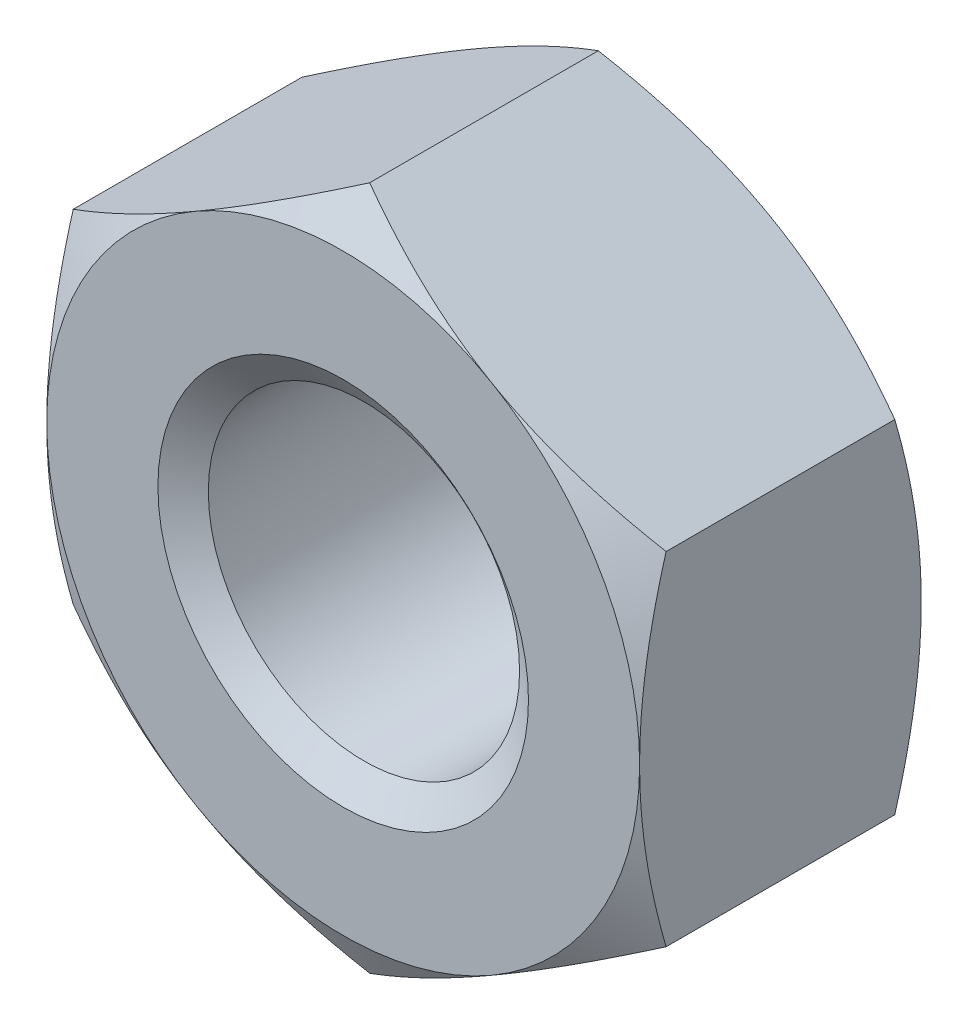
ISO-10303-21;
HEADER;
FILE_DESCRIPTION(('STEP AP214'),'2;1');
FILE_NAME('part.step','',(''),(''),'','','');
FILE_SCHEMA(('AUTOMOTIVE_DESIGN { 1 0 10303 214 1 1 1 1 }'));
ENDSEC;
DATA;
#1=APPLICATION_CONTEXT('core data for automotive mechanical design processes');
#2=APPLICATION_PROTOCOL_DEFINITION('international standard','automotive_design',2000,#1);
#3=PRODUCT_CONTEXT('',#1,'mechanical');
#4=PRODUCT('Part','Part','',(#3));
#5=PRODUCT_RELATED_PRODUCT_CATEGORY('part','',(#4));
#6=PRODUCT_DEFINITION_FORMATION('','',#4);
#7=PRODUCT_DEFINITION_CONTEXT('part definition',#1,'design');
#8=PRODUCT_DEFINITION('design','',#6,#7);
#9=PRODUCT_DEFINITION_SHAPE('','',#8);
#10=(LENGTH_UNIT() NAMED_UNIT(*) SI_UNIT(.MILLI.,.METRE.));
#11=(NAMED_UNIT(*) PLANE_ANGLE_UNIT() SI_UNIT($,.RADIAN.));
#12=(NAMED_UNIT(*) SI_UNIT($,.STERADIAN.) SOLID_ANGLE_UNIT());
#13=UNCERTAINTY_MEASURE_WITH_UNIT(LENGTH_MEASURE(1.E-05),#10,'distance_accuracy_value','');
#14=(GEOMETRIC_REPRESENTATION_CONTEXT(3) GLOBAL_UNCERTAINTY_ASSIGNED_CONTEXT((#13)) GLOBAL_UNIT_ASSIGNED_CONTEXT((#10,
#11,#12)) REPRESENTATION_CONTEXT('',''));
#15=CARTESIAN_POINT('',(0.,0.,0.));
#16=DIRECTION('',(0.,0.,1.));
#17=DIRECTION('',(1.,0.,0.));
#18=AXIS2_PLACEMENT_3D('',#15,#16,#17);
#19=CARTESIAN_POINT('',(0.,0.,-3.8));
#20=DIRECTION('',(0.,0.,1.));
#21=DIRECTION('',(1.,0.,0.));
#22=AXIS2_PLACEMENT_3D('',#19,#20,#21);
#23=CYLINDRICAL_SURFACE('',#22,2.1);
#24=CARTESIAN_POINT('',(0.,0.,-0.280083015283883));
#25=DIRECTION('',(0.,0.,1.));
#26=DIRECTION('',(1.,0.,0.));
#27=AXIS2_PLACEMENT_3D('',#24,#25,#26);
#28=CIRCLE('',#27,2.1);
#29=CARTESIAN_POINT('',(2.1,0.,-0.280083015283883));
#30=VERTEX_POINT('',#29);
#31=EDGE_CURVE('E177',#30,#30,#28,.F.);
#32=CARTESIAN_POINT('',(0.,0.,-3.49451698471611));
#33=DIRECTION('',(0.,0.,-1.));
#34=DIRECTION('',(-1.,0.,0.));
#35=AXIS2_PLACEMENT_3D('',#32,#33,#34);
#36=CIRCLE('',#35,2.1);
#37=CARTESIAN_POINT('',(2.1,0.,-3.49451698471611));
#38=VERTEX_POINT('',#37);
#39=EDGE_CURVE('E42',#38,#38,#36,.F.);
#40=CARTESIAN_POINT('',(2.1,0.,-0.280083015283883));
#41=CARTESIAN_POINT('',(2.1,0.,-0.313566702465469));
#42=CARTESIAN_POINT('',(2.1,0.,-0.347050389647055));
#43=CARTESIAN_POINT('',(2.1,0.,-0.414017764010226));
#44=CARTESIAN_POINT('',(2.1,0.,-0.447501451191812));
#45=CARTESIAN_POINT('',(2.1,0.,-0.514468825554983));
#46=CARTESIAN_POINT('',(2.1,0.,-0.547952512736569));
#47=CARTESIAN_POINT('',(2.1,0.,-0.614919887099741));
#48=CARTESIAN_POINT('',(2.1,0.,-0.648403574281326));
#49=CARTESIAN_POINT('',(2.1,0.,-0.715370948644498));
#50=CARTESIAN_POINT('',(2.1,0.,-0.748854635826083));
#51=CARTESIAN_POINT('',(2.1,0.,-0.815822010189255));
#52=CARTESIAN_POINT('',(2.1,0.,-0.84930569737084));
#53=CARTESIAN_POINT('',(2.1,0.,-0.916273071734012));
#54=CARTESIAN_POINT('',(2.1,0.,-0.949756758915598));
#55=CARTESIAN_POINT('',(2.1,0.,-1.01672413327877));
#56=CARTESIAN_POINT('',(2.1,0.,-1.05020782046035));
#57=CARTESIAN_POINT('',(2.1,0.,-1.11717519482353));
#58=CARTESIAN_POINT('',(2.1,0.,-1.15065888200511));
#59=CARTESIAN_POINT('',(2.1,0.,-1.21762625636828));
#60=CARTESIAN_POINT('',(2.1,0.,-1.25110994354987));
#61=CARTESIAN_POINT('',(2.1,0.,-1.31807731791304));
#62=CARTESIAN_POINT('',(2.1,0.,-1.35156100509463));
#63=CARTESIAN_POINT('',(2.1,0.,-1.4185283794578));
#64=CARTESIAN_POINT('',(2.1,0.,-1.45201206663938));
#65=CARTESIAN_POINT('',(2.1,0.,-1.51897944100255));
#66=CARTESIAN_POINT('',(2.1,0.,-1.55246312818414));
#67=CARTESIAN_POINT('',(2.1,0.,-1.61943050254731));
#68=CARTESIAN_POINT('',(2.1,0.,-1.6529141897289));
#69=CARTESIAN_POINT('',(2.1,0.,-1.71988156409207));
#70=CARTESIAN_POINT('',(2.1,0.,-1.75336525127366));
#71=CARTESIAN_POINT('',(2.1,0.,-1.82033262563683));
#72=CARTESIAN_POINT('',(2.1,0.,-1.85381631281841));
#73=CARTESIAN_POINT('',(2.1,0.,-1.92078368718158));
#74=CARTESIAN_POINT('',(2.1,0.,-1.95426737436317));
#75=CARTESIAN_POINT('',(2.1,0.,-2.02123474872634));
#76=CARTESIAN_POINT('',(2.1,0.,-2.05471843590793));
#77=CARTESIAN_POINT('',(2.1,0.,-2.1216858102711));
#78=CARTESIAN_POINT('',(2.1,0.,-2.15516949745268));
#79=CARTESIAN_POINT('',(2.1,0.,-2.22213687181585));
#80=CARTESIAN_POINT('',(2.1,0.,-2.25562055899744));
#81=CARTESIAN_POINT('',(2.1,0.,-2.32258793336061));
#82=CARTESIAN_POINT('',(2.1,0.,-2.3560716205422));
#83=CARTESIAN_POINT('',(2.1,0.,-2.42303899490537));
#84=CARTESIAN_POINT('',(2.1,0.,-2.45652268208696));
#85=CARTESIAN_POINT('',(2.1,0.,-2.52349005645013));
#86=CARTESIAN_POINT('',(2.1,0.,-2.55697374363171));
#87=CARTESIAN_POINT('',(2.1,0.,-2.62394111799488));
#88=CARTESIAN_POINT('',(2.1,0.,-2.65742480517647));
#89=CARTESIAN_POINT('',(2.1,0.,-2.72439217953964));
#90=CARTESIAN_POINT('',(2.1,0.,-2.75787586672123));
#91=CARTESIAN_POINT('',(2.1,0.,-2.8248432410844));
#92=CARTESIAN_POINT('',(2.1,0.,-2.85832692826598));
#93=CARTESIAN_POINT('',(2.1,0.,-2.92529430262916));
#94=CARTESIAN_POINT('',(2.1,0.,-2.95877798981074));
#95=CARTESIAN_POINT('',(2.1,0.,-3.02574536417391));
#96=CARTESIAN_POINT('',(2.1,0.,-3.0592290513555));
#97=CARTESIAN_POINT('',(2.1,0.,-3.12619642571867));
#98=CARTESIAN_POINT('',(2.1,0.,-3.15968011290025));
#99=CARTESIAN_POINT('',(2.1,0.,-3.22664748726343));
#100=CARTESIAN_POINT('',(2.1,0.,-3.26013117444501));
#101=CARTESIAN_POINT('',(2.1,0.,-3.32709854880818));
#102=CARTESIAN_POINT('',(2.1,0.,-3.36058223598977));
#103=CARTESIAN_POINT('',(2.1,0.,-3.42754961035294));
#104=CARTESIAN_POINT('',(2.1,0.,-3.46103329753453));
#105=CARTESIAN_POINT('',(2.1,0.,-3.49451698471611));
#106=B_SPLINE_CURVE_WITH_KNOTS('',3,(#40,#41,#42,#43,#44,#45,#46,#47,#48,#49,#50,#51,#52,#53,
#54,#55,#56,#57,#58,#59,#60,#61,#62,#63,#64,#65,#66,#67,#68,#69,#70,#71,#72,#73,#74,#75,#76,#77,
#78,#79,#80,#81,#82,#83,#84,#85,#86,#87,#88,#89,#90,#91,#92,#93,#94,#95,#96,#97,#98,#99,#100,
#101,#102,#103,#104,#105),.UNSPECIFIED.,.F.,.F.,(4,2,2,2,2,2,2,2,2,2,2,2,2,2,2,2,2,2,2,2,2,2,2,
2,2,2,2,2,2,2,2,2,4),(0.,0.100451061544757,0.200902123089514,0.301353184634272,
0.401804246179029,0.502255307723786,0.602706369268543,0.7031574308133,0.803608492358057,
0.904059553902815,1.00451061544757,1.10496167699233,1.20541273853709,1.30586380008184,
1.4063148616266,1.50676592317136,1.60721698471611,1.70766804626087,1.80811910780563,
1.90857016935039,2.00902123089514,2.1094722924399,2.20992335398466,2.31037441552942,
2.41082547707417,2.51127653861893,2.61172760016369,2.71217866170844,2.8126297232532,
2.91308078479796,3.01353184634271,3.11398290788747,3.21443396943223),.UNSPECIFIED.);
#107=EDGE_CURVE('BSEAM37',#30,#38,#106,.T.);
#108=ORIENTED_EDGE('',*,*,#31,.F.);
#109=ORIENTED_EDGE('',*,*,#39,.F.);
#110=ORIENTED_EDGE('',*,*,#107,.T.);
#111=ORIENTED_EDGE('',*,*,#107,.F.);
#112=EDGE_LOOP('',(#108,#110,#109,#111));
#113=FACE_BOUND('',#112,.T.);
#114=ADVANCED_FACE('F37',(#113),#23,.F.);
#115=CARTESIAN_POINT('',(0.,4.61880215351702,-3.8));
#116=DIRECTION('',(-0.500000000000002,0.866025403784437,0.));
#117=DIRECTION('',(-0.866025403784437,-0.500000000000002,0.));
#118=AXIS2_PLACEMENT_3D('',#115,#116,#117);
#119=PLANE('',#118);
#120=DIRECTION('',(0.,0.,1.));
#121=VECTOR('',#120,1.);
#122=CARTESIAN_POINT('',(-4.,2.3094010767585,-3.8));
#123=LINE('',#122,#121);
#124=CARTESIAN_POINT('',(-4.,2.30940107675853,-3.44273441009183));
#125=VERTEX_POINT('',#124);
#126=CARTESIAN_POINT('',(-4.,2.3094010767585,-0.357265589908163));
#127=VERTEX_POINT('',#126);
#128=EDGE_CURVE('E167',#125,#127,#123,.T.);
#129=ORIENTED_EDGE('',*,*,#128,.T.);
#130=CARTESIAN_POINT('',(-4.0002,2.30928560670466,-0.357332259074767));
#131=CARTESIAN_POINT('',(-3.82442084967677,2.4107717464617,-0.298717873648282));
#132=CARTESIAN_POINT('',(-3.64712438367362,2.51313390883499,-0.245410321462262));
#133=CARTESIAN_POINT('',(-3.28946140682429,2.71963072479811,-0.152361670746403));
#134=CARTESIAN_POINT('',(-3.10908854102985,2.82376904741904,-0.112653489029704));
#135=CARTESIAN_POINT('',(-2.75057818129721,3.03075510011795,-0.0508422152802782));
#136=CARTESIAN_POINT('',(-2.57249584706486,3.13357098372491,-0.0283277315228876));
#137=CARTESIAN_POINT('',(-2.21549328283349,3.33968651028528,-0.00145062314658073));
#138=CARTESIAN_POINT('',(-2.0365743503559,3.44298540411434,0.00293425857305741));
#139=CARTESIAN_POINT('',(-1.70225715780327,3.63600352522932,-0.00619007293997043));
#140=CARTESIAN_POINT('',(-1.54680884001293,3.72575165335065,-0.0174589539879949));
#141=CARTESIAN_POINT('',(-1.23692494436494,3.90466320392055,-0.0531739907981951));
#142=CARTESIAN_POINT('',(-1.08249043825587,3.99382600759479,-0.0776323457115358));
#143=CARTESIAN_POINT('',(-0.771967672225416,4.17310641015198,-0.138776064919294));
#144=CARTESIAN_POINT('',(-0.61591871193689,4.26320131938132,-0.175720603654869));
#145=CARTESIAN_POINT('',(-0.306148164596151,4.44204742827552,-0.259570072548035));
#146=CARTESIAN_POINT('',(-0.15242260922621,4.53080091904968,-0.306455302212749));
#147=CARTESIAN_POINT('',(0.000200000000011913,4.61891762357086,-0.357332259074778));
#148=B_SPLINE_CURVE_WITH_KNOTS('',3,(#130,#131,#132,#133,#134,#135,#136,#137,#138,#139,#140,
#141,#142,#143,#144,#145,#146,#147),.UNSPECIFIED.,.F.,.F.,(4,2,2,2,2,2,2,2,4),(0.,
0.634047835695967,1.26961969224543,1.88946157213122,2.50854226669297,3.04757825393386,
3.58711366126904,4.13861653143765,4.68903648037745),.UNSPECIFIED.);
#149=CARTESIAN_POINT('',(-2.00000000000001,3.46410161513775,0.));
#150=VERTEX_POINT('',#149);
#151=EDGE_CURVE('E136',#127,#150,#148,.T.);
#152=ORIENTED_EDGE('',*,*,#151,.T.);
#153=CARTESIAN_POINT('',(0.,4.61880215351702,-0.357265589908173));
#154=VERTEX_POINT('',#153);
#155=EDGE_CURVE('E56',#150,#154,#148,.T.);
#156=ORIENTED_EDGE('',*,*,#155,.T.);
#157=DIRECTION('',(0.,0.,1.));
#158=VECTOR('',#157,1.);
#159=CARTESIAN_POINT('',(0.,4.61880215351702,-3.8));
#160=LINE('',#159,#158);
#161=CARTESIAN_POINT('',(0.,4.61880215351702,-3.44273441009183));
#162=VERTEX_POINT('',#161);
#163=EDGE_CURVE('E152',#162,#154,#160,.T.);
#164=ORIENTED_EDGE('',*,*,#163,.F.);
#165=CARTESIAN_POINT('',(-4.0002,2.30928560670466,-3.44266774092523));
#166=CARTESIAN_POINT('',(-3.82442084967677,2.4107717464617,-3.50128212635172));
#167=CARTESIAN_POINT('',(-3.64712438367362,2.51313390883499,-3.55458967853774));
#168=CARTESIAN_POINT('',(-3.28946140682429,2.71963072479811,-3.6476383292536));
#169=CARTESIAN_POINT('',(-3.10908854102985,2.82376904741904,-3.6873465109703));
#170=CARTESIAN_POINT('',(-2.75057818129721,3.03075510011795,-3.74915778471972));
#171=CARTESIAN_POINT('',(-2.57249584706486,3.13357098372491,-3.77167226847711));
#172=CARTESIAN_POINT('',(-2.21549328283349,3.33968651028528,-3.79854937685342));
#173=CARTESIAN_POINT('',(-2.0365743503559,3.44298540411434,-3.80293425857306));
#174=CARTESIAN_POINT('',(-1.70225715780327,3.63600352522932,-3.79380992706003));
#175=CARTESIAN_POINT('',(-1.54680884001293,3.72575165335065,-3.78254104601201));
#176=CARTESIAN_POINT('',(-1.23692494436494,3.90466320392055,-3.74682600920181));
#177=CARTESIAN_POINT('',(-1.08249043825587,3.99382600759479,-3.72236765428846));
#178=CARTESIAN_POINT('',(-0.771967672225416,4.17310641015198,-3.66122393508071));
#179=CARTESIAN_POINT('',(-0.61591871193689,4.26320131938132,-3.62427939634513));
#180=CARTESIAN_POINT('',(-0.306148164596151,4.44204742827552,-3.54042992745197));
#181=CARTESIAN_POINT('',(-0.15242260922621,4.53080091904968,-3.49354469778725));
#182=CARTESIAN_POINT('',(0.000200000000011699,4.61891762357086,-3.44266774092522));
#183=B_SPLINE_CURVE_WITH_KNOTS('',3,(#165,#166,#167,#168,#169,#170,#171,#172,#173,#174,#175,
#176,#177,#178,#179,#180,#181,#182),.UNSPECIFIED.,.F.,.F.,(4,2,2,2,2,2,2,2,4),(0.,
0.634047835695966,1.26961969224543,1.88946157213122,2.50854226669297,3.04757825393386,
3.58711366126904,4.13861653143765,4.68903648037745),.UNSPECIFIED.);
#184=CARTESIAN_POINT('',(-2.00000000000001,3.46410161513775,-3.8));
#185=VERTEX_POINT('',#184);
#186=EDGE_CURVE('E170',#185,#162,#183,.T.);
#187=ORIENTED_EDGE('',*,*,#186,.F.);
#188=EDGE_CURVE('E262',#125,#185,#183,.T.);
#189=ORIENTED_EDGE('',*,*,#188,.F.);
#190=EDGE_LOOP('',(#129,#152,#156,#164,#187,#189));
#191=FACE_BOUND('',#190,.T.);
#192=ADVANCED_FACE('F39',(#191),#119,.T.);
#193=CARTESIAN_POINT('',(4.,2.30940107675848,-3.8));
#194=DIRECTION('',(0.500000000000007,0.866025403784435,0.));
#195=DIRECTION('',(-0.866025403784435,0.500000000000007,0.));
#196=AXIS2_PLACEMENT_3D('',#193,#194,#195);
#197=PLANE('',#196);
#198=ORIENTED_EDGE('',*,*,#163,.T.);
#199=CARTESIAN_POINT('',(-0.00019999999998845,4.61891762357086,-0.357332259074778));
#200=CARTESIAN_POINT('',(0.17557915032324,4.51743148381382,-0.298717873648292));
#201=CARTESIAN_POINT('',(0.352875616326392,4.41506932144053,-0.245410321462271));
#202=CARTESIAN_POINT('',(0.710538593175718,4.2085725054774,-0.152361670746409));
#203=CARTESIAN_POINT('',(0.890911458970162,4.10443418285647,-0.112653489029709));
#204=CARTESIAN_POINT('',(1.2494218187028,3.89744813015756,-0.0508422152802824));
#205=CARTESIAN_POINT('',(1.42750415293515,3.79463224655059,-0.0283277315228912));
#206=CARTESIAN_POINT('',(1.78450671716652,3.58851671999022,-0.00145062314658241));
#207=CARTESIAN_POINT('',(1.96342564964411,3.48521782616116,0.00293425857305697));
#208=CARTESIAN_POINT('',(2.29774284219674,3.29219970504618,-0.00619007293996894));
#209=CARTESIAN_POINT('',(2.45319115998708,3.20245157692485,-0.0174589539879925));
#210=CARTESIAN_POINT('',(2.76307505563506,3.02354002635495,-0.0531739907981908));
#211=CARTESIAN_POINT('',(2.91750956174414,2.93437722268071,-0.0776323457115306));
#212=CARTESIAN_POINT('',(3.22803232777459,2.75509682012352,-0.138776064919287));
#213=CARTESIAN_POINT('',(3.38408128806311,2.66500191089418,-0.175720603654861));
#214=CARTESIAN_POINT('',(3.69385183540384,2.48615580199999,-0.259570072548024));
#215=CARTESIAN_POINT('',(3.84757739077378,2.39740231122583,-0.306455302212737));
#216=CARTESIAN_POINT('',(4.0002,2.30928560670464,-0.357332259074764));
#217=B_SPLINE_CURVE_WITH_KNOTS('',3,(#199,#200,#201,#202,#203,#204,#205,#206,#207,#208,#209,
#210,#211,#212,#213,#214,#215,#216),.UNSPECIFIED.,.F.,.F.,(4,2,2,2,2,2,2,2,4),(0.,
0.634047835695969,1.26961969224544,1.88946157213123,2.50854226669298,3.04757825393387,
3.58711366126905,4.13861653143765,4.68903648037745),.UNSPECIFIED.);
#218=CARTESIAN_POINT('',(2.00000000000003,3.46410161513774,0.));
#219=VERTEX_POINT('',#218);
#220=EDGE_CURVE('E146',#154,#219,#217,.T.);
#221=ORIENTED_EDGE('',*,*,#220,.T.);
#222=CARTESIAN_POINT('',(4.,2.30940107675852,-0.357265589908173));
#223=VERTEX_POINT('',#222);
#224=EDGE_CURVE('E63',#219,#223,#217,.T.);
#225=ORIENTED_EDGE('',*,*,#224,.T.);
#226=DIRECTION('',(0.,0.,1.));
#227=VECTOR('',#226,1.);
#228=CARTESIAN_POINT('',(4.,2.30940107675848,-3.8));
#229=LINE('',#228,#227);
#230=CARTESIAN_POINT('',(4.,2.30940107675852,-3.44273441009183));
#231=VERTEX_POINT('',#230);
#232=EDGE_CURVE('E145',#231,#223,#229,.T.);
#233=ORIENTED_EDGE('',*,*,#232,.F.);
#234=CARTESIAN_POINT('',(-0.00019999999998845,4.61891762357086,-3.44266774092522));
#235=CARTESIAN_POINT('',(0.175579150323239,4.51743148381382,-3.50128212635171));
#236=CARTESIAN_POINT('',(0.352875616326392,4.41506932144053,-3.55458967853773));
#237=CARTESIAN_POINT('',(0.710538593175718,4.2085725054774,-3.64763832925359));
#238=CARTESIAN_POINT('',(0.890911458970162,4.10443418285647,-3.68734651097029));
#239=CARTESIAN_POINT('',(1.2494218187028,3.89744813015756,-3.74915778471972));
#240=CARTESIAN_POINT('',(1.42750415293515,3.79463224655059,-3.77167226847711));
#241=CARTESIAN_POINT('',(1.78450671716652,3.58851671999022,-3.79854937685342));
#242=CARTESIAN_POINT('',(1.96342564964411,3.48521782616116,-3.80293425857306));
#243=CARTESIAN_POINT('',(2.29774284219674,3.29219970504618,-3.79380992706003));
#244=CARTESIAN_POINT('',(2.45319115998707,3.20245157692485,-3.78254104601201));
#245=CARTESIAN_POINT('',(2.76307505563506,3.02354002635495,-3.74682600920181));
#246=CARTESIAN_POINT('',(2.91750956174414,2.93437722268071,-3.72236765428847));
#247=CARTESIAN_POINT('',(3.22803232777458,2.75509682012352,-3.66122393508071));
#248=CARTESIAN_POINT('',(3.38408128806311,2.66500191089418,-3.62427939634514));
#249=CARTESIAN_POINT('',(3.69385183540384,2.48615580199999,-3.54042992745198));
#250=CARTESIAN_POINT('',(3.84757739077378,2.39740231122583,-3.49354469778726));
#251=CARTESIAN_POINT('',(4.0002,2.30928560670464,-3.44266774092524));
#252=B_SPLINE_CURVE_WITH_KNOTS('',3,(#234,#235,#236,#237,#238,#239,#240,#241,#242,#243,#244,
#245,#246,#247,#248,#249,#250,#251),.UNSPECIFIED.,.F.,.F.,(4,2,2,2,2,2,2,2,4),(0.,
0.634047835695969,1.26961969224544,1.88946157213123,2.50854226669298,3.04757825393387,
3.58711366126904,4.13861653143765,4.68903648037744),.UNSPECIFIED.);
#253=CARTESIAN_POINT('',(2.00000000000003,3.46410161513774,-3.8));
#254=VERTEX_POINT('',#253);
#255=EDGE_CURVE('E256',#254,#231,#252,.T.);
#256=ORIENTED_EDGE('',*,*,#255,.F.);
#257=EDGE_CURVE('E261',#162,#254,#252,.T.);
#258=ORIENTED_EDGE('',*,*,#257,.F.);
#259=EDGE_LOOP('',(#198,#221,#225,#233,#256,#258));
#260=FACE_BOUND('',#259,.T.);
#261=ADVANCED_FACE('F143',(#260),#197,.T.);
#262=CARTESIAN_POINT('',(4.,2.30940107675848,-3.8));
#263=DIRECTION('',(-1.,0.,0.));
#264=DIRECTION('',(0.,0.,1.));
#265=AXIS2_PLACEMENT_3D('',#262,#263,#264);
#266=PLANE('',#265);
#267=CARTESIAN_POINT('',(4.,-6.12487198995896,-1.91410682124067));
#268=CARTESIAN_POINT('',(4.,-5.9492493703868,-1.82923627076692));
#269=CARTESIAN_POINT('',(4.,-5.7732115209529,-1.74520940380742));
#270=CARTESIAN_POINT('',(4.,-5.42008084777958,-1.57932514679719));
#271=CARTESIAN_POINT('',(4.,-5.24298784779931,-1.49746813236725));
#272=CARTESIAN_POINT('',(4.,-4.88656571686338,-1.33597446305858));
#273=CARTESIAN_POINT('',(4.,-4.70722958889366,-1.25635319506306));
#274=CARTESIAN_POINT('',(4.,-4.34708334747267,-1.10053058542032));
#275=CARTESIAN_POINT('',(4.,-4.16627331143541,-1.02432906550804));
#276=CARTESIAN_POINT('',(4.,-3.80064706744981,-0.87535065039438));
#277=CARTESIAN_POINT('',(4.,-3.61580892822773,-0.802627284215863));
#278=CARTESIAN_POINT('',(4.,-3.24395246794972,-0.662876230959436));
#279=CARTESIAN_POINT('',(4.,-3.05693390695804,-0.595849177566519));
#280=CARTESIAN_POINT('',(4.,-2.68080318253774,-0.469291748430895));
#281=CARTESIAN_POINT('',(4.,-2.49169643712852,-0.40974543478385));
#282=CARTESIAN_POINT('',(4.,-2.11079454635854,-0.300083356544518));
#283=CARTESIAN_POINT('',(4.,-1.91900027185752,-0.249964609676762));
#284=CARTESIAN_POINT('',(4.,-1.53259232698203,-0.16159079495405));
#285=CARTESIAN_POINT('',(4.,-1.33797792031653,-0.123338885956548));
#286=CARTESIAN_POINT('',(4.,-0.946402725872582,-0.0612742359223494));
#287=CARTESIAN_POINT('',(4.,-0.749441936019801,-0.0374615076517037));
#288=CARTESIAN_POINT('',(4.,-0.355451989627968,-0.00638181314943935));
#289=CARTESIAN_POINT('',(4.,-0.158431311094036,0.000989900761038751));
#290=CARTESIAN_POINT('',(4.,0.235472085607445,-0.00120406637479729));
#291=CARTESIAN_POINT('',(4.,0.432354826312183,-0.0107653508153519));
#292=CARTESIAN_POINT('',(4.,0.768560635225495,-0.0408787346135909));
#293=CARTESIAN_POINT('',(4.,0.908254618381797,-0.0575092960439094));
#294=CARTESIAN_POINT('',(4.,1.18656349063495,-0.0982134103466906));
#295=CARTESIAN_POINT('',(4.,1.32517820601011,-0.122288137058445));
#296=CARTESIAN_POINT('',(4.,1.73929045452967,-0.204415070950228));
#297=CARTESIAN_POINT('',(4.,2.01284690528719,-0.272348886425149));
#298=CARTESIAN_POINT('',(4.,2.42218253014521,-0.389516359317198));
#299=CARTESIAN_POINT('',(4.,2.56009536361535,-0.43171394181163));
#300=CARTESIAN_POINT('',(4.,2.83448159101401,-0.520284580227756));
#301=CARTESIAN_POINT('',(4.,2.97095590623554,-0.566654756186905));
#302=CARTESIAN_POINT('',(4.,3.24189440516337,-0.662605699180278));
#303=CARTESIAN_POINT('',(4.,3.37636557946834,-0.712166925753491));
#304=CARTESIAN_POINT('',(4.,3.6442646115291,-0.814198353790692));
#305=CARTESIAN_POINT('',(4.,3.77769202239383,-0.866669730963359));
#306=CARTESIAN_POINT('',(4.,3.9106369898668,-0.920309006541781));
#307=B_SPLINE_CURVE_WITH_KNOTS('',3,(#267,#268,#269,#270,#271,#272,#273,#274,#275,#276,#277,
#278,#279,#280,#281,#282,#283,#284,#285,#286,#287,#288,#289,#290,#291,#292,#293,#294,#295,#296,
#297,#298,#299,#300,#301,#302,#303,#304,#305,#306),.UNSPECIFIED.,.F.,.F.,(4,2,2,2,2,2,2,2,2,2,2,
2,2,2,2,2,2,2,2,4),(0.,0.585171792532274,1.17044423059927,1.7590659464599,2.34765694284828,
2.94347400997485,3.5393572721069,4.13394864697602,4.72835161391473,5.32291267067847,
5.91747425310815,6.50823685854039,7.09884609659889,7.52068140825524,7.94258327130842,
8.78701491359831,9.2196528189769,9.65199437116298,10.0819024146297,10.5119854255247),.UNSPECIFIED.);
#308=CARTESIAN_POINT('',(3.99999999999999,-2.30940107675855,-0.357265589908173));
#309=VERTEX_POINT('',#308);
#310=CARTESIAN_POINT('',(4.,0.,0.));
#311=VERTEX_POINT('',#310);
#312=EDGE_CURVE('E138',#309,#311,#307,.T.);
#313=ORIENTED_EDGE('',*,*,#312,.F.);
#314=DIRECTION('',(0.,0.,1.));
#315=VECTOR('',#314,1.);
#316=CARTESIAN_POINT('',(4.,-2.30940107675854,-3.8));
#317=LINE('',#316,#315);
#318=CARTESIAN_POINT('',(3.99999999999999,-2.30940107675855,-3.44273441009183));
#319=VERTEX_POINT('',#318);
#320=EDGE_CURVE('E153',#319,#309,#317,.T.);
#321=ORIENTED_EDGE('',*,*,#320,.F.);
#322=CARTESIAN_POINT('',(4.,-6.12487198995896,-1.88589317875934));
#323=CARTESIAN_POINT('',(4.,-5.9492493703868,-1.97076372923308));
#324=CARTESIAN_POINT('',(4.,-5.7732115209529,-2.05479059619258));
#325=CARTESIAN_POINT('',(4.,-5.42008084777958,-2.22067485320281));
#326=CARTESIAN_POINT('',(4.,-5.24298784779931,-2.30253186763275));
#327=CARTESIAN_POINT('',(4.,-4.88656571686338,-2.46402553694142));
#328=CARTESIAN_POINT('',(4.,-4.70722958889366,-2.54364680493694));
#329=CARTESIAN_POINT('',(4.,-4.34708334747267,-2.69946941457968));
#330=CARTESIAN_POINT('',(4.,-4.16627331143541,-2.77567093449196));
#331=CARTESIAN_POINT('',(4.,-3.80064706744981,-2.92464934960562));
#332=CARTESIAN_POINT('',(4.,-3.61580892822773,-2.99737271578414));
#333=CARTESIAN_POINT('',(4.,-3.24395246794972,-3.13712376904057));
#334=CARTESIAN_POINT('',(4.,-3.05693390695804,-3.20415082243348));
#335=CARTESIAN_POINT('',(4.,-2.68080318253774,-3.33070825156911));
#336=CARTESIAN_POINT('',(4.,-2.49169643712852,-3.39025456521615));
#337=CARTESIAN_POINT('',(4.,-2.11079454635854,-3.49991664345548));
#338=CARTESIAN_POINT('',(4.,-1.91900027185752,-3.55003539032324));
#339=CARTESIAN_POINT('',(4.,-1.53259232698203,-3.63840920504595));
#340=CARTESIAN_POINT('',(4.,-1.33797792031653,-3.67666111404345));
#341=CARTESIAN_POINT('',(4.,-0.946402725872582,-3.73872576407765));
#342=CARTESIAN_POINT('',(4.,-0.749441936019801,-3.7625384923483));
#343=CARTESIAN_POINT('',(4.,-0.355451989627968,-3.79361818685056));
#344=CARTESIAN_POINT('',(4.,-0.158431311094036,-3.80098990076104));
#345=CARTESIAN_POINT('',(4.,0.235472085607445,-3.7987959336252));
#346=CARTESIAN_POINT('',(4.,0.432354826312182,-3.78923464918465));
#347=CARTESIAN_POINT('',(4.,0.768560635225494,-3.75912126538641));
#348=CARTESIAN_POINT('',(4.,0.908254618381797,-3.74249070395609));
#349=CARTESIAN_POINT('',(4.,1.18656349063495,-3.70178658965331));
#350=CARTESIAN_POINT('',(4.,1.32517820601011,-3.67771186294156));
#351=CARTESIAN_POINT('',(4.,1.73929045452967,-3.59558492904977));
#352=CARTESIAN_POINT('',(4.,2.01284690528719,-3.52765111357485));
#353=CARTESIAN_POINT('',(4.,2.42218253014521,-3.4104836406828));
#354=CARTESIAN_POINT('',(4.,2.56009536361536,-3.36828605818837));
#355=CARTESIAN_POINT('',(4.,2.83448159101401,-3.27971541977224));
#356=CARTESIAN_POINT('',(4.,2.97095590623554,-3.23334524381309));
#357=CARTESIAN_POINT('',(4.,3.24189440516338,-3.13739430081972));
#358=CARTESIAN_POINT('',(4.,3.37636557946835,-3.08783307424651));
#359=CARTESIAN_POINT('',(4.,3.6442646115291,-2.98580164620931));
#360=CARTESIAN_POINT('',(4.,3.77769202239384,-2.93333026903664));
#361=CARTESIAN_POINT('',(4.,3.91063698986681,-2.87969099345822));
#362=B_SPLINE_CURVE_WITH_KNOTS('',3,(#322,#323,#324,#325,#326,#327,#328,#329,#330,#331,#332,
#333,#334,#335,#336,#337,#338,#339,#340,#341,#342,#343,#344,#345,#346,#347,#348,#349,#350,#351,
#352,#353,#354,#355,#356,#357,#358,#359,#360,#361),.UNSPECIFIED.,.F.,.F.,(4,2,2,2,2,2,2,2,2,2,2,
2,2,2,2,2,2,2,2,4),(0.,0.585171792532274,1.17044423059927,1.7590659464599,2.34765694284828,
2.94347400997484,3.5393572721069,4.13394864697602,4.72835161391473,5.32291267067847,
5.91747425310815,6.50823685854039,7.09884609659889,7.52068140825523,7.94258327130842,
8.78701491359831,9.21965281897691,9.65199437116299,10.0819024146297,10.5119854255247),.UNSPECIFIED.);
#363=CARTESIAN_POINT('',(4.,0.,-3.8));
#364=VERTEX_POINT('',#363);
#365=EDGE_CURVE('E268',#319,#364,#362,.T.);
#366=ORIENTED_EDGE('',*,*,#365,.T.);
#367=EDGE_CURVE('E151',#364,#231,#362,.T.);
#368=ORIENTED_EDGE('',*,*,#367,.T.);
#369=ORIENTED_EDGE('',*,*,#232,.T.);
#370=EDGE_CURVE('E128',#311,#223,#307,.T.);
#371=ORIENTED_EDGE('',*,*,#370,.F.);
#372=EDGE_LOOP('',(#313,#321,#366,#368,#369,#371));
#373=FACE_BOUND('',#372,.T.);
#374=ADVANCED_FACE('F149',(#373),#266,.F.);
#375=CARTESIAN_POINT('',(0.,-4.61880215351706,-3.8));
#376=DIRECTION('',(0.500000000000003,-0.866025403784437,0.));
#377=DIRECTION('',(0.866025403784437,0.500000000000003,0.));
#378=AXIS2_PLACEMENT_3D('',#375,#376,#377);
#379=PLANE('',#378);
#380=ORIENTED_EDGE('',*,*,#320,.T.);
#381=CARTESIAN_POINT('',(4.0002,-2.3092856067047,-0.357332259074782));
#382=CARTESIAN_POINT('',(3.82442084967677,-2.41077174646174,-0.298717873648297));
#383=CARTESIAN_POINT('',(3.64712438367362,-2.51313390883503,-0.245410321462278));
#384=CARTESIAN_POINT('',(3.28946140682429,-2.71963072479816,-0.15236167074642));
#385=CARTESIAN_POINT('',(3.10908854102985,-2.82376904741909,-0.112653489029721));
#386=CARTESIAN_POINT('',(2.75057818129721,-3.030755100118,-0.0508422152802972));
#387=CARTESIAN_POINT('',(2.57249584706485,-3.13357098372496,-0.028327731522908));
#388=CARTESIAN_POINT('',(2.21549328283349,-3.33968651028533,-0.00145062314660317));
#389=CARTESIAN_POINT('',(2.03657435035589,-3.44298540411439,0.00293425857303421));
#390=CARTESIAN_POINT('',(1.70225715780326,-3.63600352522937,-0.00619007293999524));
#391=CARTESIAN_POINT('',(1.54680884001293,-3.7257516533507,-0.0174589539880203));
#392=CARTESIAN_POINT('',(1.23692494436494,-3.9046632039206,-0.0531739907982211));
#393=CARTESIAN_POINT('',(1.08249043825586,-3.99382600759484,-0.0776323457115618));
#394=CARTESIAN_POINT('',(0.771967672225418,-4.17310641015202,-0.13877606491932));
#395=CARTESIAN_POINT('',(0.615918711936894,-4.26320131938136,-0.175720603654895));
#396=CARTESIAN_POINT('',(0.306148164596158,-4.44204742827556,-0.25957007254806));
#397=CARTESIAN_POINT('',(0.152422609226218,-4.53080091904972,-0.306455302212774));
#398=CARTESIAN_POINT('',(-0.000200000000002172,-4.6189176235709,-0.357332259074801));
#399=B_SPLINE_CURVE_WITH_KNOTS('',3,(#381,#382,#383,#384,#385,#386,#387,#388,#389,#390,#391,
#392,#393,#394,#395,#396,#397,#398),.UNSPECIFIED.,.F.,.F.,(4,2,2,2,2,2,2,2,4),(0.,
0.634047835695971,1.26961969224544,1.88946157213123,2.50854226669299,3.04757825393387,
3.58711366126905,4.13861653143765,4.68903648037745),.UNSPECIFIED.);
#400=CARTESIAN_POINT('',(2.00000000000001,-3.46410161513775,0.));
#401=VERTEX_POINT('',#400);
#402=EDGE_CURVE('E362',#309,#401,#399,.T.);
#403=ORIENTED_EDGE('',*,*,#402,.T.);
#404=CARTESIAN_POINT('',(0.,-4.61880215351702,-0.357265589908173));
#405=VERTEX_POINT('',#404);
#406=EDGE_CURVE('E228',#401,#405,#399,.T.);
#407=ORIENTED_EDGE('',*,*,#406,.T.);
#408=DIRECTION('',(0.,0.,1.));
#409=VECTOR('',#408,1.);
#410=CARTESIAN_POINT('',(0.,-4.61880215351706,-3.8));
#411=LINE('',#410,#409);
#412=CARTESIAN_POINT('',(0.,-4.61880215351702,-3.44273441009183));
#413=VERTEX_POINT('',#412);
#414=EDGE_CURVE('E158',#413,#405,#411,.T.);
#415=ORIENTED_EDGE('',*,*,#414,.F.);
#416=CARTESIAN_POINT('',(4.0002,-2.3092856067047,-3.44266774092522));
#417=CARTESIAN_POINT('',(3.82442084967677,-2.41077174646174,-3.5012821263517));
#418=CARTESIAN_POINT('',(3.64712438367362,-2.51313390883503,-3.55458967853772));
#419=CARTESIAN_POINT('',(3.28946140682429,-2.71963072479816,-3.64763832925358));
#420=CARTESIAN_POINT('',(3.10908854102985,-2.82376904741909,-3.68734651097028));
#421=CARTESIAN_POINT('',(2.75057818129721,-3.030755100118,-3.7491577847197));
#422=CARTESIAN_POINT('',(2.57249584706485,-3.13357098372496,-3.77167226847709));
#423=CARTESIAN_POINT('',(2.21549328283349,-3.33968651028533,-3.7985493768534));
#424=CARTESIAN_POINT('',(2.03657435035589,-3.44298540411439,-3.80293425857303));
#425=CARTESIAN_POINT('',(1.70225715780326,-3.63600352522937,-3.79380992706001));
#426=CARTESIAN_POINT('',(1.54680884001293,-3.7257516533507,-3.78254104601198));
#427=CARTESIAN_POINT('',(1.23692494436494,-3.9046632039206,-3.74682600920178));
#428=CARTESIAN_POINT('',(1.08249043825586,-3.99382600759484,-3.72236765428844));
#429=CARTESIAN_POINT('',(0.771967672225417,-4.17310641015202,-3.66122393508068));
#430=CARTESIAN_POINT('',(0.615918711936894,-4.26320131938137,-3.62427939634511));
#431=CARTESIAN_POINT('',(0.306148164596158,-4.44204742827556,-3.54042992745194));
#432=CARTESIAN_POINT('',(0.152422609226218,-4.53080091904972,-3.49354469778723));
#433=CARTESIAN_POINT('',(-0.000200000000002082,-4.6189176235709,-3.4426677409252));
#434=B_SPLINE_CURVE_WITH_KNOTS('',3,(#416,#417,#418,#419,#420,#421,#422,#423,#424,#425,#426,
#427,#428,#429,#430,#431,#432,#433),.UNSPECIFIED.,.F.,.F.,(4,2,2,2,2,2,2,2,4),(0.,
0.63404783569597,1.26961969224544,1.88946157213123,2.50854226669298,3.04757825393387,
3.58711366126905,4.13861653143765,4.68903648037745),.UNSPECIFIED.);
#435=CARTESIAN_POINT('',(2.00000000000001,-3.46410161513775,-3.8));
#436=VERTEX_POINT('',#435);
#437=EDGE_CURVE('E274',#436,#413,#434,.T.);
#438=ORIENTED_EDGE('',*,*,#437,.F.);
#439=EDGE_CURVE('E273',#319,#436,#434,.T.);
#440=ORIENTED_EDGE('',*,*,#439,.F.);
#441=EDGE_LOOP('',(#380,#403,#407,#415,#438,#440));
#442=FACE_BOUND('',#441,.T.);
#443=ADVANCED_FACE('F284',(#442),#379,.T.);
#444=CARTESIAN_POINT('',(-4.,-2.30940107675853,-3.8));
#445=DIRECTION('',(-0.500000000000006,-0.866025403784435,0.));
#446=DIRECTION('',(0.866025403784436,-0.500000000000006,0.));
#447=AXIS2_PLACEMENT_3D('',#444,#445,#446);
#448=PLANE('',#447);
#449=ORIENTED_EDGE('',*,*,#414,.T.);
#450=CARTESIAN_POINT('',(0.000199999999997729,-4.6189176235709,-0.357332259074802));
#451=CARTESIAN_POINT('',(-0.175579150323232,-4.51743148381386,-0.298717873648315));
#452=CARTESIAN_POINT('',(-0.352875616326386,-4.41506932144057,-0.245410321462294));
#453=CARTESIAN_POINT('',(-0.710538593175715,-4.20857250547744,-0.152361670746431));
#454=CARTESIAN_POINT('',(-0.890911458970161,-4.10443418285651,-0.112653489029731));
#455=CARTESIAN_POINT('',(-1.2494218187028,-3.8974481301576,-0.0508422152803026));
#456=CARTESIAN_POINT('',(-1.42750415293516,-3.79463224655063,-0.028327731522911));
#457=CARTESIAN_POINT('',(-1.78450671716653,-3.58851671999026,-0.00145062314660219));
#458=CARTESIAN_POINT('',(-1.96342564964412,-3.4852178261612,0.00293425857303676));
#459=CARTESIAN_POINT('',(-2.29774284219675,-3.29219970504621,-0.00619007293998898));
#460=CARTESIAN_POINT('',(-2.45319115998708,-3.20245157692489,-0.0174589539880118));
#461=CARTESIAN_POINT('',(-2.76307505563507,-3.02354002635499,-0.053173990798209));
#462=CARTESIAN_POINT('',(-2.91750956174414,-2.93437722268075,-0.0776323457115484));
#463=CARTESIAN_POINT('',(-3.22803232777459,-2.75509682012356,-0.138776064919303));
#464=CARTESIAN_POINT('',(-3.38408128806311,-2.66500191089422,-0.175720603654876));
#465=CARTESIAN_POINT('',(-3.69385183540384,-2.48615580200003,-0.259570072548038));
#466=CARTESIAN_POINT('',(-3.84757739077378,-2.39740231122587,-0.30645530221275));
#467=CARTESIAN_POINT('',(-4.0002,-2.30928560670469,-0.357332259074776));
#468=B_SPLINE_CURVE_WITH_KNOTS('',3,(#450,#451,#452,#453,#454,#455,#456,#457,#458,#459,#460,
#461,#462,#463,#464,#465,#466,#467),.UNSPECIFIED.,.F.,.F.,(4,2,2,2,2,2,2,2,4),(0.,
0.634047835695974,1.26961969224545,1.88946157213125,2.508542266693,3.04757825393389,
3.58711366126906,4.13861653143766,4.68903648037745),.UNSPECIFIED.);
#469=CARTESIAN_POINT('',(-2.00000000000002,-3.46410161513774,0.));
#470=VERTEX_POINT('',#469);
#471=EDGE_CURVE('E359',#405,#470,#468,.T.);
#472=ORIENTED_EDGE('',*,*,#471,.T.);
#473=CARTESIAN_POINT('',(-4.,-2.30940107675853,-0.357265589908173));
#474=VERTEX_POINT('',#473);
#475=EDGE_CURVE('E202',#470,#474,#468,.T.);
#476=ORIENTED_EDGE('',*,*,#475,.T.);
#477=DIRECTION('',(0.,0.,1.));
#478=VECTOR('',#477,1.);
#479=CARTESIAN_POINT('',(-4.,-2.30940107675853,-3.8));
#480=LINE('',#479,#478);
#481=CARTESIAN_POINT('',(-4.,-2.30940107675853,-3.44273441009183));
#482=VERTEX_POINT('',#481);
#483=EDGE_CURVE('E164',#482,#474,#480,.T.);
#484=ORIENTED_EDGE('',*,*,#483,.F.);
#485=CARTESIAN_POINT('',(0.000199999999997729,-4.6189176235709,-3.4426677409252));
#486=CARTESIAN_POINT('',(-0.175579150323232,-4.51743148381386,-3.50128212635169));
#487=CARTESIAN_POINT('',(-0.352875616326386,-4.41506932144057,-3.55458967853771));
#488=CARTESIAN_POINT('',(-0.710538593175715,-4.20857250547744,-3.64763832925357));
#489=CARTESIAN_POINT('',(-0.890911458970161,-4.10443418285651,-3.68734651097027));
#490=CARTESIAN_POINT('',(-1.2494218187028,-3.8974481301576,-3.7491577847197));
#491=CARTESIAN_POINT('',(-1.42750415293516,-3.79463224655063,-3.77167226847709));
#492=CARTESIAN_POINT('',(-1.78450671716653,-3.58851671999026,-3.7985493768534));
#493=CARTESIAN_POINT('',(-1.96342564964412,-3.4852178261612,-3.80293425857304));
#494=CARTESIAN_POINT('',(-2.29774284219675,-3.29219970504621,-3.79380992706001));
#495=CARTESIAN_POINT('',(-2.45319115998708,-3.20245157692489,-3.78254104601199));
#496=CARTESIAN_POINT('',(-2.76307505563507,-3.02354002635499,-3.74682600920179));
#497=CARTESIAN_POINT('',(-2.91750956174414,-2.93437722268075,-3.72236765428845));
#498=CARTESIAN_POINT('',(-3.22803232777459,-2.75509682012356,-3.6612239350807));
#499=CARTESIAN_POINT('',(-3.38408128806311,-2.66500191089422,-3.62427939634512));
#500=CARTESIAN_POINT('',(-3.69385183540384,-2.48615580200003,-3.54042992745196));
#501=CARTESIAN_POINT('',(-3.84757739077378,-2.39740231122587,-3.49354469778725));
#502=CARTESIAN_POINT('',(-4.0002,-2.30928560670469,-3.44266774092522));
#503=B_SPLINE_CURVE_WITH_KNOTS('',3,(#485,#486,#487,#488,#489,#490,#491,#492,#493,#494,#495,
#496,#497,#498,#499,#500,#501,#502),.UNSPECIFIED.,.F.,.F.,(4,2,2,2,2,2,2,2,4),(0.,
0.634047835695974,1.26961969224545,1.88946157213125,2.508542266693,3.04757825393389,
3.58711366126906,4.13861653143766,4.68903648037745),.UNSPECIFIED.);
#504=CARTESIAN_POINT('',(-2.00000000000002,-3.46410161513774,-3.8));
#505=VERTEX_POINT('',#504);
#506=EDGE_CURVE('E280',#505,#482,#503,.T.);
#507=ORIENTED_EDGE('',*,*,#506,.F.);
#508=EDGE_CURVE('E279',#413,#505,#503,.T.);
#509=ORIENTED_EDGE('',*,*,#508,.F.);
#510=EDGE_LOOP('',(#449,#472,#476,#484,#507,#509));
#511=FACE_BOUND('',#510,.T.);
#512=ADVANCED_FACE('F287',(#511),#448,.T.);
#513=CARTESIAN_POINT('',(-4.,2.3094010767585,-3.8));
#514=DIRECTION('',(-1.,0.,0.));
#515=DIRECTION('',(0.,0.,1.));
#516=AXIS2_PLACEMENT_3D('',#513,#514,#515);
#517=PLANE('',#516);
#518=ORIENTED_EDGE('',*,*,#483,.T.);
#519=CARTESIAN_POINT('',(-4.,-6.12487198995894,-1.91410682124066));
#520=CARTESIAN_POINT('',(-4.,-5.94924937038678,-1.82923627076691));
#521=CARTESIAN_POINT('',(-4.,-5.77321152095288,-1.74520940380741));
#522=CARTESIAN_POINT('',(-4.,-5.42008084777957,-1.57932514679718));
#523=CARTESIAN_POINT('',(-4.,-5.2429878477993,-1.49746813236725));
#524=CARTESIAN_POINT('',(-4.,-4.88656571686336,-1.33597446305857));
#525=CARTESIAN_POINT('',(-4.,-4.70722958889364,-1.25635319506305));
#526=CARTESIAN_POINT('',(-4.,-4.34708334747265,-1.10053058542031));
#527=CARTESIAN_POINT('',(-4.,-4.1662733114354,-1.02432906550803));
#528=CARTESIAN_POINT('',(-4.,-3.80064706744979,-0.875350650394373));
#529=CARTESIAN_POINT('',(-4.,-3.61580892822772,-0.802627284215855));
#530=CARTESIAN_POINT('',(-4.,-3.2439524679497,-0.662876230959429));
#531=CARTESIAN_POINT('',(-4.,-3.05693390695803,-0.595849177566513));
#532=CARTESIAN_POINT('',(-4.,-2.68080318253772,-0.46929174843089));
#533=CARTESIAN_POINT('',(-4.,-2.4916964371285,-0.409745434783845));
#534=CARTESIAN_POINT('',(-4.,-2.11079454635853,-0.300083356544513));
#535=CARTESIAN_POINT('',(-4.,-1.91900027185751,-0.249964609676757));
#536=CARTESIAN_POINT('',(-4.,-1.53259232698202,-0.161590794954046));
#537=CARTESIAN_POINT('',(-4.,-1.33797792031651,-0.123338885956544));
#538=CARTESIAN_POINT('',(-4.,-0.94640272587257,-0.0612742359223458));
#539=CARTESIAN_POINT('',(-4.,-0.74944193601979,-0.0374615076517008));
#540=CARTESIAN_POINT('',(-4.,-0.355451989627958,-0.00638181314943726));
#541=CARTESIAN_POINT('',(-4.,-0.158431311094026,0.000989900761040817));
#542=CARTESIAN_POINT('',(-4.,0.235472085607455,-0.00120406637479535));
#543=CARTESIAN_POINT('',(-4.,0.432354826312192,-0.0107653508153501));
#544=CARTESIAN_POINT('',(-4.,0.768560635225503,-0.0408787346135896));
#545=CARTESIAN_POINT('',(-4.,0.908254618381805,-0.0575092960439084));
#546=CARTESIAN_POINT('',(-4.,1.18656349063496,-0.0982134103466897));
#547=CARTESIAN_POINT('',(-4.,1.32517820601012,-0.122288137058444));
#548=CARTESIAN_POINT('',(-4.,1.73929045452967,-0.204415070950227));
#549=CARTESIAN_POINT('',(-4.,2.0128469052872,-0.272348886425149));
#550=CARTESIAN_POINT('',(-4.,2.42218253014521,-0.389516359317198));
#551=CARTESIAN_POINT('',(-4.,2.56009536361536,-0.43171394181163));
#552=CARTESIAN_POINT('',(-4.,2.83448159101401,-0.520284580227756));
#553=CARTESIAN_POINT('',(-4.,2.97095590623555,-0.566654756186906));
#554=CARTESIAN_POINT('',(-4.,3.24189440516338,-0.662605699180279));
#555=CARTESIAN_POINT('',(-4.,3.37636557946835,-0.712166925753493));
#556=CARTESIAN_POINT('',(-4.,3.64426461152911,-0.814198353790694));
#557=CARTESIAN_POINT('',(-4.,3.77769202239384,-0.866669730963361));
#558=CARTESIAN_POINT('',(-4.,3.91063698986681,-0.920309006541785));
#559=B_SPLINE_CURVE_WITH_KNOTS('',3,(#519,#520,#521,#522,#523,#524,#525,#526,#527,#528,#529,
#530,#531,#532,#533,#534,#535,#536,#537,#538,#539,#540,#541,#542,#543,#544,#545,#546,#547,#548,
#549,#550,#551,#552,#553,#554,#555,#556,#557,#558),.UNSPECIFIED.,.F.,.F.,(4,2,2,2,2,2,2,2,2,2,2,
2,2,2,2,2,2,2,2,4),(0.,0.585171792532271,1.17044423059927,1.7590659464599,2.34765694284827,
2.94347400997484,3.5393572721069,4.13394864697601,4.72835161391472,5.32291267067846,
5.91747425310814,6.50823685854038,7.09884609659888,7.52068140825522,7.9425832713084,
8.7870149135983,9.21965281897689,9.65199437116297,10.0819024146297,10.5119854255247),.UNSPECIFIED.);
#560=CARTESIAN_POINT('',(-4.,0.,0.));
#561=VERTEX_POINT('',#560);
#562=EDGE_CURVE('E201',#474,#561,#559,.T.);
#563=ORIENTED_EDGE('',*,*,#562,.T.);
#564=EDGE_CURVE('E194',#561,#127,#559,.T.);
#565=ORIENTED_EDGE('',*,*,#564,.T.);
#566=ORIENTED_EDGE('',*,*,#128,.F.);
#567=CARTESIAN_POINT('',(-4.,-6.12487198995894,-1.88589317875935));
#568=CARTESIAN_POINT('',(-4.,-5.94924937038678,-1.97076372923309));
#569=CARTESIAN_POINT('',(-4.,-5.77321152095288,-2.05479059619259));
#570=CARTESIAN_POINT('',(-4.,-5.42008084777957,-2.22067485320282));
#571=CARTESIAN_POINT('',(-4.,-5.2429878477993,-2.30253186763276));
#572=CARTESIAN_POINT('',(-4.,-4.88656571686336,-2.46402553694143));
#573=CARTESIAN_POINT('',(-4.,-4.70722958889364,-2.54364680493695));
#574=CARTESIAN_POINT('',(-4.,-4.34708334747265,-2.69946941457969));
#575=CARTESIAN_POINT('',(-4.,-4.16627331143539,-2.77567093449197));
#576=CARTESIAN_POINT('',(-4.,-3.80064706744979,-2.92464934960563));
#577=CARTESIAN_POINT('',(-4.,-3.61580892822772,-2.99737271578415));
#578=CARTESIAN_POINT('',(-4.,-3.2439524679497,-3.13712376904057));
#579=CARTESIAN_POINT('',(-4.,-3.05693390695803,-3.20415082243349));
#580=CARTESIAN_POINT('',(-4.,-2.68080318253772,-3.33070825156911));
#581=CARTESIAN_POINT('',(-4.,-2.4916964371285,-3.39025456521616));
#582=CARTESIAN_POINT('',(-4.,-2.11079454635853,-3.49991664345549));
#583=CARTESIAN_POINT('',(-4.,-1.9190002718575,-3.55003539032324));
#584=CARTESIAN_POINT('',(-4.,-1.53259232698202,-3.63840920504595));
#585=CARTESIAN_POINT('',(-4.,-1.33797792031651,-3.67666111404346));
#586=CARTESIAN_POINT('',(-4.,-0.94640272587257,-3.73872576407765));
#587=CARTESIAN_POINT('',(-4.,-0.74944193601979,-3.7625384923483));
#588=CARTESIAN_POINT('',(-4.,-0.355451989627958,-3.79361818685056));
#589=CARTESIAN_POINT('',(-4.,-0.158431311094026,-3.80098990076104));
#590=CARTESIAN_POINT('',(-4.,0.235472085607454,-3.7987959336252));
#591=CARTESIAN_POINT('',(-4.,0.432354826312192,-3.78923464918465));
#592=CARTESIAN_POINT('',(-4.,0.768560635225503,-3.75912126538641));
#593=CARTESIAN_POINT('',(-4.,0.908254618381805,-3.74249070395609));
#594=CARTESIAN_POINT('',(-4.,1.18656349063496,-3.70178658965331));
#595=CARTESIAN_POINT('',(-4.,1.32517820601012,-3.67771186294156));
#596=CARTESIAN_POINT('',(-4.,1.73929045452968,-3.59558492904977));
#597=CARTESIAN_POINT('',(-4.,2.0128469052872,-3.52765111357485));
#598=CARTESIAN_POINT('',(-4.,2.42218253014522,-3.4104836406828));
#599=CARTESIAN_POINT('',(-4.,2.56009536361537,-3.36828605818837));
#600=CARTESIAN_POINT('',(-4.,2.83448159101402,-3.27971541977224));
#601=CARTESIAN_POINT('',(-4.,2.97095590623555,-3.23334524381309));
#602=CARTESIAN_POINT('',(-4.,3.24189440516339,-3.13739430081972));
#603=CARTESIAN_POINT('',(-4.,3.37636557946836,-3.08783307424651));
#604=CARTESIAN_POINT('',(-4.,3.64426461152912,-2.9858016462093));
#605=CARTESIAN_POINT('',(-4.,3.77769202239385,-2.93333026903664));
#606=CARTESIAN_POINT('',(-4.,3.91063698986682,-2.87969099345822));
#607=B_SPLINE_CURVE_WITH_KNOTS('',3,(#567,#568,#569,#570,#571,#572,#573,#574,#575,#576,#577,
#578,#579,#580,#581,#582,#583,#584,#585,#586,#587,#588,#589,#590,#591,#592,#593,#594,#595,#596,
#597,#598,#599,#600,#601,#602,#603,#604,#605,#606),.UNSPECIFIED.,.F.,.F.,(4,2,2,2,2,2,2,2,2,2,2,
2,2,2,2,2,2,2,2,4),(0.,0.585171792532271,1.17044423059927,1.7590659464599,2.34765694284827,
2.94347400997484,3.5393572721069,4.13394864697601,4.72835161391472,5.32291267067846,
5.91747425310814,6.50823685854038,7.09884609659888,7.52068140825522,7.94258327130841,
8.7870149135983,9.2196528189769,9.65199437116298,10.0819024146297,10.5119854255247),.UNSPECIFIED.);
#608=CARTESIAN_POINT('',(-4.,0.,-3.8));
#609=VERTEX_POINT('',#608);
#610=EDGE_CURVE('E331',#609,#125,#607,.T.);
#611=ORIENTED_EDGE('',*,*,#610,.F.);
#612=EDGE_CURVE('E334',#482,#609,#607,.T.);
#613=ORIENTED_EDGE('',*,*,#612,.F.);
#614=EDGE_LOOP('',(#518,#563,#565,#566,#611,#613));
#615=FACE_BOUND('',#614,.T.);
#616=ADVANCED_FACE('F208',(#615),#517,.T.);
#617=CARTESIAN_POINT('',(0.,4.61880215351702,0.));
#618=DIRECTION('',(0.,0.,-1.));
#619=DIRECTION('',(-1.,0.,0.));
#620=AXIS2_PLACEMENT_3D('',#617,#618,#619);
#621=PLANE('',#620);
#622=CARTESIAN_POINT('',(0.,0.,0.));
#623=DIRECTION('',(0.,0.,1.));
#624=DIRECTION('',(1.,0.,0.));
#625=AXIS2_PLACEMENT_3D('',#622,#623,#624);
#626=CIRCLE('',#625,2.5);
#627=CARTESIAN_POINT('',(2.5,0.,0.));
#628=VERTEX_POINT('',#627);
#629=EDGE_CURVE('E179',#628,#628,#626,.T.);
#630=ORIENTED_EDGE('',*,*,#629,.F.);
#631=EDGE_LOOP('',(#630));
#632=FACE_BOUND('',#631,.T.);
#633=CARTESIAN_POINT('',(0.,0.,0.));
#634=DIRECTION('',(0.,0.,-1.));
#635=DIRECTION('',(-1.,0.,0.));
#636=AXIS2_PLACEMENT_3D('',#633,#634,#635);
#637=CIRCLE('',#636,4.);
#638=EDGE_CURVE('E11',#561,#150,#637,.T.);
#639=ORIENTED_EDGE('',*,*,#638,.F.);
#640=EDGE_CURVE('E49',#470,#561,#637,.T.);
#641=ORIENTED_EDGE('',*,*,#640,.F.);
#642=EDGE_CURVE('E176',#401,#470,#637,.T.);
#643=ORIENTED_EDGE('',*,*,#642,.F.);
#644=EDGE_CURVE('E366',#311,#401,#637,.T.);
#645=ORIENTED_EDGE('',*,*,#644,.F.);
#646=CARTESIAN_POINT('',(0.,0.,0.));
#647=DIRECTION('',(0.,0.,1.));
#648=DIRECTION('',(1.,0.,0.));
#649=AXIS2_PLACEMENT_3D('',#646,#647,#648);
#650=CIRCLE('',#649,4.);
#651=EDGE_CURVE('E131',#311,#219,#650,.T.);
#652=ORIENTED_EDGE('',*,*,#651,.T.);
#653=EDGE_CURVE('E47',#150,#219,#637,.T.);
#654=ORIENTED_EDGE('',*,*,#653,.F.);
#655=EDGE_LOOP('',(#639,#641,#643,#645,#652,#654));
#656=FACE_BOUND('',#655,.T.);
#657=ADVANCED_FACE('F252',(#632,#656),#621,.F.);
#658=CARTESIAN_POINT('',(0.,4.61880215351702,-3.8));
#659=DIRECTION('',(0.,0.,-1.));
#660=DIRECTION('',(-1.,0.,0.));
#661=AXIS2_PLACEMENT_3D('',#658,#659,#660);
#662=PLANE('',#661);
#663=CARTESIAN_POINT('',(0.,0.,-3.8));
#664=DIRECTION('',(0.,0.,-1.));
#665=DIRECTION('',(-1.,0.,0.));
#666=AXIS2_PLACEMENT_3D('',#663,#664,#665);
#667=CIRCLE('',#666,2.5);
#668=CARTESIAN_POINT('',(-2.5,0.,-3.8));
#669=VERTEX_POINT('',#668);
#670=EDGE_CURVE('E180',#669,#669,#667,.F.);
#671=ORIENTED_EDGE('',*,*,#670,.T.);
#672=EDGE_LOOP('',(#671));
#673=FACE_BOUND('',#672,.T.);
#674=CARTESIAN_POINT('',(0.,0.,-3.8));
#675=DIRECTION('',(0.,0.,-1.));
#676=DIRECTION('',(-1.,0.,0.));
#677=AXIS2_PLACEMENT_3D('',#674,#675,#676);
#678=CIRCLE('',#677,4.);
#679=EDGE_CURVE('E173',#609,#505,#678,.F.);
#680=ORIENTED_EDGE('',*,*,#679,.F.);
#681=EDGE_CURVE('E155',#185,#609,#678,.F.);
#682=ORIENTED_EDGE('',*,*,#681,.F.);
#683=EDGE_CURVE('E172',#254,#185,#678,.F.);
#684=ORIENTED_EDGE('',*,*,#683,.F.);
#685=CARTESIAN_POINT('',(0.,0.,-3.8));
#686=DIRECTION('',(0.,0.,1.));
#687=DIRECTION('',(1.,0.,0.));
#688=AXIS2_PLACEMENT_3D('',#685,#686,#687);
#689=CIRCLE('',#688,4.);
#690=EDGE_CURVE('E247',#364,#254,#689,.T.);
#691=ORIENTED_EDGE('',*,*,#690,.F.);
#692=EDGE_CURVE('E346',#436,#364,#678,.F.);
#693=ORIENTED_EDGE('',*,*,#692,.F.);
#694=EDGE_CURVE('E326',#505,#436,#678,.F.);
#695=ORIENTED_EDGE('',*,*,#694,.F.);
#696=EDGE_LOOP('',(#680,#682,#684,#691,#693,#695));
#697=FACE_BOUND('',#696,.T.);
#698=ADVANCED_FACE('F306',(#673,#697),#662,.T.);
#699=CARTESIAN_POINT('',(0.,0.,-3.8));
#700=DIRECTION('',(0.,0.,1.));
#701=DIRECTION('',(1.,0.,0.));
#702=AXIS2_PLACEMENT_3D('',#699,#700,#701);
#703=CONICAL_SURFACE('',#702,4.,1.0471975511966);
#704=ORIENTED_EDGE('',*,*,#188,.T.);
#705=ORIENTED_EDGE('',*,*,#681,.T.);
#706=ORIENTED_EDGE('',*,*,#610,.T.);
#707=EDGE_LOOP('',(#704,#705,#706));
#708=FACE_BOUND('',#707,.T.);
#709=ADVANCED_FACE('F308',(#708),#703,.T.);
#710=ORIENTED_EDGE('',*,*,#186,.T.);
#711=ORIENTED_EDGE('',*,*,#257,.T.);
#712=ORIENTED_EDGE('',*,*,#683,.T.);
#713=EDGE_LOOP('',(#710,#711,#712));
#714=FACE_BOUND('',#713,.T.);
#715=ADVANCED_FACE('F313',(#714),#703,.T.);
#716=ORIENTED_EDGE('',*,*,#255,.T.);
#717=ORIENTED_EDGE('',*,*,#367,.F.);
#718=ORIENTED_EDGE('',*,*,#690,.T.);
#719=EDGE_LOOP('',(#716,#717,#718));
#720=FACE_BOUND('',#719,.T.);
#721=ADVANCED_FACE('F369',(#720),#703,.T.);
#722=ORIENTED_EDGE('',*,*,#439,.T.);
#723=ORIENTED_EDGE('',*,*,#692,.T.);
#724=ORIENTED_EDGE('',*,*,#365,.F.);
#725=EDGE_LOOP('',(#722,#723,#724));
#726=FACE_BOUND('',#725,.T.);
#727=ADVANCED_FACE('F316',(#726),#703,.T.);
#728=ORIENTED_EDGE('',*,*,#437,.T.);
#729=ORIENTED_EDGE('',*,*,#508,.T.);
#730=ORIENTED_EDGE('',*,*,#694,.T.);
#731=EDGE_LOOP('',(#728,#729,#730));
#732=FACE_BOUND('',#731,.T.);
#733=ADVANCED_FACE('F315',(#732),#703,.T.);
#734=ORIENTED_EDGE('',*,*,#506,.T.);
#735=ORIENTED_EDGE('',*,*,#612,.T.);
#736=ORIENTED_EDGE('',*,*,#679,.T.);
#737=EDGE_LOOP('',(#734,#735,#736));
#738=FACE_BOUND('',#737,.T.);
#739=ADVANCED_FACE('F216',(#738),#703,.T.);
#740=CARTESIAN_POINT('',(0.,0.,0.));
#741=DIRECTION('',(0.,0.,-1.));
#742=DIRECTION('',(-1.,0.,0.));
#743=AXIS2_PLACEMENT_3D('',#740,#741,#742);
#744=CONICAL_SURFACE('',#743,4.,1.0471975511966);
#745=ORIENTED_EDGE('',*,*,#640,.T.);
#746=ORIENTED_EDGE('',*,*,#562,.F.);
#747=ORIENTED_EDGE('',*,*,#475,.F.);
#748=EDGE_LOOP('',(#745,#746,#747));
#749=FACE_BOUND('',#748,.T.);
#750=ADVANCED_FACE('F210',(#749),#744,.T.);
#751=ORIENTED_EDGE('',*,*,#642,.T.);
#752=ORIENTED_EDGE('',*,*,#471,.F.);
#753=ORIENTED_EDGE('',*,*,#406,.F.);
#754=EDGE_LOOP('',(#751,#752,#753));
#755=FACE_BOUND('',#754,.T.);
#756=ADVANCED_FACE('F215',(#755),#744,.T.);
#757=ORIENTED_EDGE('',*,*,#312,.T.);
#758=ORIENTED_EDGE('',*,*,#644,.T.);
#759=ORIENTED_EDGE('',*,*,#402,.F.);
#760=EDGE_LOOP('',(#757,#758,#759));
#761=FACE_BOUND('',#760,.T.);
#762=ADVANCED_FACE('F365',(#761),#744,.T.);
#763=ORIENTED_EDGE('',*,*,#651,.F.);
#764=ORIENTED_EDGE('',*,*,#370,.T.);
#765=ORIENTED_EDGE('',*,*,#224,.F.);
#766=EDGE_LOOP('',(#763,#764,#765));
#767=FACE_BOUND('',#766,.T.);
#768=ADVANCED_FACE('F129',(#767),#744,.T.);
#769=ORIENTED_EDGE('',*,*,#653,.T.);
#770=ORIENTED_EDGE('',*,*,#220,.F.);
#771=ORIENTED_EDGE('',*,*,#155,.F.);
#772=EDGE_LOOP('',(#769,#770,#771));
#773=FACE_BOUND('',#772,.T.);
#774=ADVANCED_FACE('F218',(#773),#744,.T.);
#775=ORIENTED_EDGE('',*,*,#564,.F.);
#776=ORIENTED_EDGE('',*,*,#638,.T.);
#777=ORIENTED_EDGE('',*,*,#151,.F.);
#778=EDGE_LOOP('',(#775,#776,#777));
#779=FACE_BOUND('',#778,.T.);
#780=ADVANCED_FACE('F395',(#779),#744,.T.);
#781=CARTESIAN_POINT('',(0.,0.,-0.308091316812271));
#782=DIRECTION('',(0.,0.,1.));
#783=DIRECTION('',(1.,0.,0.));
#784=AXIS2_PLACEMENT_3D('',#781,#782,#783);
#785=CONICAL_SURFACE('',#784,2.06,0.959931088596878);
#786=ORIENTED_EDGE('',*,*,#629,.T.);
#787=EDGE_LOOP('',(#786));
#788=FACE_BOUND('',#787,.T.);
#789=ORIENTED_EDGE('',*,*,#31,.T.);
#790=EDGE_LOOP('',(#789));
#791=FACE_BOUND('',#790,.T.);
#792=ADVANCED_FACE('F219',(#788,#791),#785,.F.);
#793=CARTESIAN_POINT('',(0.,0.,-3.7746));
#794=DIRECTION('',(0.,0.,-1.));
#795=DIRECTION('',(-1.,0.,0.));
#796=AXIS2_PLACEMENT_3D('',#793,#794,#795);
#797=CONICAL_SURFACE('',#796,2.5,0.959931088596878);
#798=CARTESIAN_POINT('',(0.,0.,-3.7746));
#799=DIRECTION('',(0.,0.,1.));
#800=DIRECTION('',(1.,0.,0.));
#801=AXIS2_PLACEMENT_3D('',#798,#799,#800);
#802=CIRCLE('',#801,2.5);
#803=CARTESIAN_POINT('',(2.5,0.,-3.7746));
#804=VERTEX_POINT('',#803);
#805=EDGE_CURVE('E182',#804,#804,#802,.T.);
#806=ORIENTED_EDGE('',*,*,#805,.F.);
#807=EDGE_LOOP('',(#806));
#808=FACE_BOUND('',#807,.T.);
#809=ORIENTED_EDGE('',*,*,#39,.T.);
#810=EDGE_LOOP('',(#809));
#811=FACE_BOUND('',#810,.T.);
#812=ADVANCED_FACE('F423',(#808,#811),#797,.F.);
#813=CARTESIAN_POINT('',(0.,0.,-25.0375057290932));
#814=DIRECTION('',(0.,0.,1.));
#815=DIRECTION('',(1.,0.,0.));
#816=AXIS2_PLACEMENT_3D('',#813,#814,#815);
#817=CYLINDRICAL_SURFACE('',#816,2.5);
#818=ORIENTED_EDGE('',*,*,#670,.F.);
#819=EDGE_LOOP('',(#818));
#820=FACE_BOUND('',#819,.T.);
#821=ORIENTED_EDGE('',*,*,#805,.T.);
#822=EDGE_LOOP('',(#821));
#823=FACE_BOUND('',#822,.T.);
#824=ADVANCED_FACE('F430',(#820,#823),#817,.F.);
#825=CLOSED_SHELL('',(#114,#192,#261,#374,#443,#512,#616,#657,#698,#709,#715,#721,#727,#733,
#739,#750,#756,#762,#768,#774,#780,#792,#812,#824));
#826=MANIFOLD_SOLID_BREP('B2',#825);
#827=ADVANCED_BREP_SHAPE_REPRESENTATION('',(#18,#826),#14);
#828=SHAPE_DEFINITION_REPRESENTATION(#9,#827);
ENDSEC;
END-ISO-10303-21;
